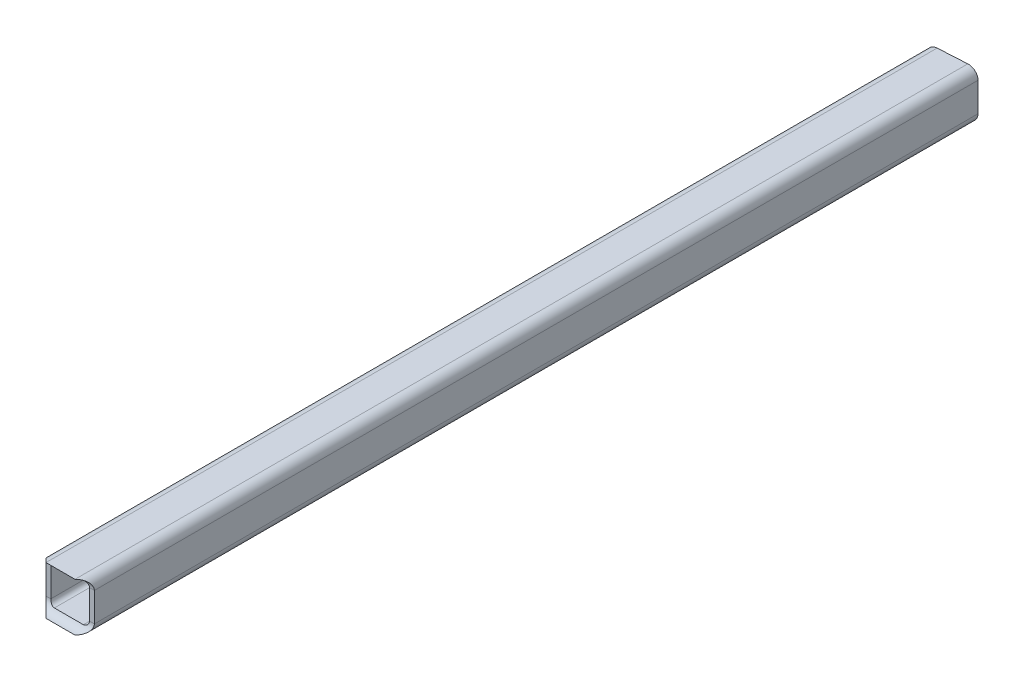
ISO-10303-21;
HEADER;
FILE_DESCRIPTION(('STEP AP214'),'2;1');
FILE_NAME('part.step','',(''),(''),'','','');
FILE_SCHEMA(('AUTOMOTIVE_DESIGN { 1 0 10303 214 1 1 1 1 }'));
ENDSEC;
DATA;
#1=APPLICATION_CONTEXT('core data for automotive mechanical design processes');
#2=APPLICATION_PROTOCOL_DEFINITION('international standard','automotive_design',2000,#1);
#3=PRODUCT_CONTEXT('',#1,'mechanical');
#4=PRODUCT('Part','Part','',(#3));
#5=PRODUCT_RELATED_PRODUCT_CATEGORY('part','',(#4));
#6=PRODUCT_DEFINITION_FORMATION('','',#4);
#7=PRODUCT_DEFINITION_CONTEXT('part definition',#1,'design');
#8=PRODUCT_DEFINITION('design','',#6,#7);
#9=PRODUCT_DEFINITION_SHAPE('','',#8);
#10=(LENGTH_UNIT() NAMED_UNIT(*) SI_UNIT(.MILLI.,.METRE.));
#11=(NAMED_UNIT(*) PLANE_ANGLE_UNIT() SI_UNIT($,.RADIAN.));
#12=(NAMED_UNIT(*) SI_UNIT($,.STERADIAN.) SOLID_ANGLE_UNIT());
#13=UNCERTAINTY_MEASURE_WITH_UNIT(LENGTH_MEASURE(1.E-05),#10,'distance_accuracy_value','');
#14=(GEOMETRIC_REPRESENTATION_CONTEXT(3) GLOBAL_UNCERTAINTY_ASSIGNED_CONTEXT((#13)) GLOBAL_UNIT_ASSIGNED_CONTEXT((#10,
#11,#12)) REPRESENTATION_CONTEXT('',''));
#15=CARTESIAN_POINT('',(0.,0.,0.));
#16=DIRECTION('',(0.,0.,1.));
#17=DIRECTION('',(1.,0.,0.));
#18=AXIS2_PLACEMENT_3D('',#15,#16,#17);
#19=CARTESIAN_POINT('',(-142.,-6.,-825.));
#20=DIRECTION('',(-1.,0.,0.));
#21=DIRECTION('',(0.,0.,1.));
#22=AXIS2_PLACEMENT_3D('',#19,#20,#21);
#23=PLANE('',#22);
#24=DIRECTION('',(0.,0.,1.));
#25=VECTOR('',#24,1.);
#26=CARTESIAN_POINT('',(-142.,-6.,-825.));
#27=LINE('',#26,#25);
#28=CARTESIAN_POINT('',(-142.,-6.00000000000001,-825.455659815234));
#29=VERTEX_POINT('',#28);
#30=CARTESIAN_POINT('',(-142.,-6.00000000000001,-460.));
#31=VERTEX_POINT('',#30);
#32=EDGE_CURVE('E206',#29,#31,#27,.T.);
#33=ORIENTED_EDGE('',*,*,#32,.T.);
#34=DIRECTION('',(0.,1.,0.));
#35=VECTOR('',#34,1.);
#36=CARTESIAN_POINT('',(-142.,-6.00000000000001,-460.));
#37=LINE('',#36,#35);
#38=CARTESIAN_POINT('',(-142.,6.00000000000001,-460.));
#39=VERTEX_POINT('',#38);
#40=EDGE_CURVE('E392',#31,#39,#37,.T.);
#41=ORIENTED_EDGE('',*,*,#40,.T.);
#42=DIRECTION('',(0.,0.,1.));
#43=VECTOR('',#42,1.);
#44=CARTESIAN_POINT('',(-142.,6.00000000000001,-825.));
#45=LINE('',#44,#43);
#46=CARTESIAN_POINT('',(-142.,6.00000000000001,-825.455659815234));
#47=VERTEX_POINT('',#46);
#48=EDGE_CURVE('E45',#47,#39,#45,.T.);
#49=ORIENTED_EDGE('',*,*,#48,.F.);
#50=DIRECTION('',(0.,-1.,0.));
#51=VECTOR('',#50,1.);
#52=CARTESIAN_POINT('',(-142.,-6.00000000000001,-825.455659815234));
#53=LINE('',#52,#51);
#54=EDGE_CURVE('E231',#47,#29,#53,.T.);
#55=ORIENTED_EDGE('',*,*,#54,.T.);
#56=EDGE_LOOP('',(#33,#41,#49,#55));
#57=FACE_BOUND('',#56,.T.);
#58=ADVANCED_FACE('F41',(#57),#23,.T.);
#59=CARTESIAN_POINT('',(-144.,-6.,-825.));
#60=DIRECTION('',(0.,0.,1.));
#61=DIRECTION('',(1.,0.,0.));
#62=AXIS2_PLACEMENT_3D('',#59,#60,#61);
#63=CYLINDRICAL_SURFACE('',#62,2.);
#64=DIRECTION('',(0.,0.,1.));
#65=VECTOR('',#64,1.);
#66=CARTESIAN_POINT('',(-144.,-8.00000000000001,-825.));
#67=LINE('',#66,#65);
#68=CARTESIAN_POINT('',(-144.,-8.00000000000001,-825.341744861426));
#69=VERTEX_POINT('',#68);
#70=CARTESIAN_POINT('',(-144.,-8.00000000000001,-459.464101615138));
#71=VERTEX_POINT('',#70);
#72=EDGE_CURVE('E229',#69,#71,#67,.T.);
#73=ORIENTED_EDGE('',*,*,#72,.T.);
#74=CARTESIAN_POINT('',(-144.,-8.00000000000001,-459.464101615138));
#75=CARTESIAN_POINT('',(-143.947619851414,-8.00000944075038,-459.464086206897));
#76=CARTESIAN_POINT('',(-143.895248262496,-7.9979425660099,-459.465289269472));
#77=CARTESIAN_POINT('',(-143.790962539768,-7.9897304838665,-459.470016320399));
#78=CARTESIAN_POINT('',(-143.739048144673,-7.98358778291064,-459.473538882355));
#79=CARTESIAN_POINT('',(-143.636351237952,-7.96734554188733,-459.482762284618));
#80=CARTESIAN_POINT('',(-143.585563899903,-7.95726921828321,-459.488450339271));
#81=CARTESIAN_POINT('',(-143.485173718524,-7.93329262121618,-459.501794905215));
#82=CARTESIAN_POINT('',(-143.435571011874,-7.91939190879698,-459.509451642461));
#83=CARTESIAN_POINT('',(-143.289230827527,-7.87223817473684,-459.53496935659));
#84=CARTESIAN_POINT('',(-143.194652845894,-7.83348371578986,-459.555408001321));
#85=CARTESIAN_POINT('',(-143.013270104245,-7.74261191461913,-459.600815863802));
#86=CARTESIAN_POINT('',(-142.926478012025,-7.69047330980902,-459.625792271799));
#87=CARTESIAN_POINT('',(-142.755384747508,-7.56932824362969,-459.679939718729));
#88=CARTESIAN_POINT('',(-142.671867171051,-7.49929131747405,-459.709286749353));
#89=CARTESIAN_POINT('',(-142.517168439054,-7.34649138732364,-459.767445210293));
#90=CARTESIAN_POINT('',(-142.44599109068,-7.26372447072445,-459.796256472877));
#91=CARTESIAN_POINT('',(-142.31323462454,-7.08093667986573,-459.852442893317));
#92=CARTESIAN_POINT('',(-142.252637325668,-6.98012524599294,-459.879587168564));
#93=CARTESIAN_POINT('',(-142.149677978647,-6.76820679758344,-459.927034072303));
#94=CARTESIAN_POINT('',(-142.107287730373,-6.65711603105188,-459.947347270489));
#95=CARTESIAN_POINT('',(-142.050318837514,-6.45499780361231,-459.975022138753));
#96=CARTESIAN_POINT('',(-142.031540376796,-6.36541132045005,-459.984307817739));
#97=CARTESIAN_POINT('',(-142.012665253275,-6.22936729210375,-459.99367902764));
#98=CARTESIAN_POINT('',(-142.007922202956,-6.18367126121309,-459.996043321681));
#99=CARTESIAN_POINT('',(-142.001587658245,-6.09198877169574,-459.999205989711));
#100=CARTESIAN_POINT('',(-141.999997460862,-6.04600220134865,-460.000003719249));
#101=CARTESIAN_POINT('',(-142.,-6.00000000000001,-460.));
#102=B_SPLINE_CURVE_WITH_KNOTS('',3,(#74,#75,#76,#77,#78,#79,#80,#81,#82,#83,#84,#85,#86,#87,
#88,#89,#90,#91,#92,#93,#94,#95,#96,#97,#98,#99,#100,#101),.UNSPECIFIED.,.F.,.F.,(4,2,2,2,2,2,2,
2,2,2,2,2,2,4),(0.,0.157071840937227,0.31404717927329,0.470109716412911,0.626190173600552,
0.937421271464443,1.24914989675584,1.58636095727879,1.9236758686098,2.28392845907451,
2.64362103970024,2.9185529216884,3.05643812246952,3.19438003420906),.UNSPECIFIED.);
#103=EDGE_CURVE('E282',#71,#31,#102,.T.);
#104=ORIENTED_EDGE('',*,*,#103,.T.);
#105=ORIENTED_EDGE('',*,*,#32,.F.);
#106=CARTESIAN_POINT('',(-144.,-6.00000000000001,-825.341744861426));
#107=DIRECTION('',(-0.0568653116741472,0.,-0.998381858973911));
#108=DIRECTION('',(-0.998381858973911,0.,0.0568653116741472));
#109=AXIS2_PLACEMENT_3D('',#106,#107,#108);
#110=ELLIPSE('',#109,2.00324152730049,2.);
#111=EDGE_CURVE('E228',#29,#69,#110,.T.);
#112=ORIENTED_EDGE('',*,*,#111,.T.);
#113=EDGE_LOOP('',(#73,#104,#105,#112));
#114=FACE_BOUND('',#113,.T.);
#115=ADVANCED_FACE('F269',(#114),#63,.F.);
#116=CARTESIAN_POINT('',(-144.,-8.00000000000001,-825.));
#117=DIRECTION('',(0.,1.,0.));
#118=DIRECTION('',(0.,0.,1.));
#119=AXIS2_PLACEMENT_3D('',#116,#117,#118);
#120=PLANE('',#119);
#121=DIRECTION('',(0.,0.,1.));
#122=VECTOR('',#121,1.);
#123=CARTESIAN_POINT('',(-156.,-8.00000000000001,-825.));
#124=LINE('',#123,#122);
#125=CARTESIAN_POINT('',(-156.,-8.00000000000001,-824.658255138574));
#126=VERTEX_POINT('',#125);
#127=CARTESIAN_POINT('',(-156.,-8.00000000000001,-459.464101615138));
#128=VERTEX_POINT('',#127);
#129=EDGE_CURVE('E225',#126,#128,#124,.T.);
#130=ORIENTED_EDGE('',*,*,#129,.T.);
#131=DIRECTION('',(1.,0.,0.));
#132=VECTOR('',#131,1.);
#133=CARTESIAN_POINT('',(-150.,-8.00000000000001,-459.464101615138));
#134=LINE('',#133,#132);
#135=EDGE_CURVE('E278',#128,#71,#134,.T.);
#136=ORIENTED_EDGE('',*,*,#135,.T.);
#137=ORIENTED_EDGE('',*,*,#72,.F.);
#138=DIRECTION('',(-0.998381858973911,0.,0.0568653116741472));
#139=VECTOR('',#138,1.);
#140=CARTESIAN_POINT('',(-144.019401982031,-8.00000000000001,-825.340639773482));
#141=LINE('',#140,#139);
#142=EDGE_CURVE('E224',#69,#126,#141,.T.);
#143=ORIENTED_EDGE('',*,*,#142,.T.);
#144=EDGE_LOOP('',(#130,#136,#137,#143));
#145=FACE_BOUND('',#144,.T.);
#146=ADVANCED_FACE('F277',(#145),#120,.T.);
#147=CARTESIAN_POINT('',(-156.,-6.,-825.));
#148=DIRECTION('',(0.,0.,1.));
#149=DIRECTION('',(1.,0.,0.));
#150=AXIS2_PLACEMENT_3D('',#147,#148,#149);
#151=CYLINDRICAL_SURFACE('',#150,2.);
#152=DIRECTION('',(0.,0.,1.));
#153=VECTOR('',#152,1.);
#154=CARTESIAN_POINT('',(-158.,-6.,-825.));
#155=LINE('',#154,#153);
#156=CARTESIAN_POINT('',(-158.,-6.00000000000001,-824.544340184766));
#157=VERTEX_POINT('',#156);
#158=CARTESIAN_POINT('',(-158.,-6.00000000000001,-460.));
#159=VERTEX_POINT('',#158);
#160=EDGE_CURVE('E221',#157,#159,#155,.T.);
#161=ORIENTED_EDGE('',*,*,#160,.T.);
#162=CARTESIAN_POINT('',(-158.,-6.00000000000001,-460.));
#163=CARTESIAN_POINT('',(-158.000008485066,-6.05279734035814,-460.000009372383));
#164=CARTESIAN_POINT('',(-157.99790957026,-6.10558867378728,-459.998954914121));
#165=CARTESIAN_POINT('',(-157.989562836513,-6.21073997309174,-459.994788652164));
#166=CARTESIAN_POINT('',(-157.983316684209,-6.2631001036993,-459.991677674919));
#167=CARTESIAN_POINT('',(-157.966779189475,-6.36677499785739,-459.983487364333));
#168=CARTESIAN_POINT('',(-157.956506484102,-6.41809344797337,-459.97841710113));
#169=CARTESIAN_POINT('',(-157.932042231314,-6.51955728033962,-459.966443571807));
#170=CARTESIAN_POINT('',(-157.917850441376,-6.56970258978428,-459.95954019225));
#171=CARTESIAN_POINT('',(-157.869643691163,-6.7177548740978,-459.936338494309));
#172=CARTESIAN_POINT('',(-157.829962412036,-6.81349322041694,-459.917530603319));
#173=CARTESIAN_POINT('',(-157.736913430591,-6.99686497280345,-459.87494033274));
#174=CARTESIAN_POINT('',(-157.683531907653,-7.08449007215681,-459.851152934385));
#175=CARTESIAN_POINT('',(-157.560968142831,-7.25500902820581,-459.799126144));
#176=CARTESIAN_POINT('',(-157.491031030009,-7.3373051787491,-459.77070543697));
#177=CARTESIAN_POINT('',(-157.338960437571,-7.48955674123603,-459.713200742879));
#178=CARTESIAN_POINT('',(-157.256817165297,-7.55950214501015,-459.684116239278));
#179=CARTESIAN_POINT('',(-157.074966607638,-7.69055248905505,-459.625957223115));
#180=CARTESIAN_POINT('',(-156.974387664184,-7.75053636310677,-459.597061813744));
#181=CARTESIAN_POINT('',(-156.763099313547,-7.85239843675653,-459.545687006942));
#182=CARTESIAN_POINT('',(-156.652412231091,-7.89431542026374,-459.523193901422));
#183=CARTESIAN_POINT('',(-156.451452480325,-7.95046034779688,-459.492344298206));
#184=CARTESIAN_POINT('',(-156.36268650425,-7.9689262582919,-459.481887525367));
#185=CARTESIAN_POINT('',(-156.227766131869,-7.98751089092497,-459.471289002469));
#186=CARTESIAN_POINT('',(-156.182400736289,-7.99218689765274,-459.468603682305));
#187=CARTESIAN_POINT('',(-156.091362583997,-7.99843381186119,-459.465006225644));
#188=CARTESIAN_POINT('',(-156.045689674496,-8.00000304070108,-459.46409504775));
#189=CARTESIAN_POINT('',(-156.,-8.00000000000001,-459.464101615138));
#190=B_SPLINE_CURVE_WITH_KNOTS('',3,(#162,#163,#164,#165,#166,#167,#168,#169,#170,#171,#172,
#173,#174,#175,#176,#177,#178,#179,#180,#181,#182,#183,#184,#185,#186,#187,#188,#189),
.UNSPECIFIED.,.F.,.F.,(4,2,2,2,2,2,2,2,2,2,2,2,2,4),(0.,0.15832980686348,0.316596024669342,
0.474138190899995,0.631690108466988,0.946146500350648,1.26092136705957,1.59454928426014,
1.92844632145531,2.28848800862788,2.64775290324077,2.92045951053446,3.05738651447663,
3.19438748205591),.UNSPECIFIED.);
#191=EDGE_CURVE('E281',#159,#128,#190,.T.);
#192=ORIENTED_EDGE('',*,*,#191,.T.);
#193=ORIENTED_EDGE('',*,*,#129,.F.);
#194=CARTESIAN_POINT('',(-156.,-6.00000000000001,-824.658255138574));
#195=DIRECTION('',(-0.0568653116741472,0.,-0.998381858973911));
#196=DIRECTION('',(-0.998381858973911,0.,0.0568653116741472));
#197=AXIS2_PLACEMENT_3D('',#194,#195,#196);
#198=ELLIPSE('',#197,2.00324152730049,2.);
#199=EDGE_CURVE('E220',#126,#157,#198,.T.);
#200=ORIENTED_EDGE('',*,*,#199,.T.);
#201=EDGE_LOOP('',(#161,#192,#193,#200));
#202=FACE_BOUND('',#201,.T.);
#203=ADVANCED_FACE('F298',(#202),#151,.F.);
#204=CARTESIAN_POINT('',(-158.,6.00000000000001,-825.));
#205=DIRECTION('',(1.,0.,0.));
#206=DIRECTION('',(0.,0.,-1.));
#207=AXIS2_PLACEMENT_3D('',#204,#205,#206);
#208=PLANE('',#207);
#209=DIRECTION('',(0.,0.,1.));
#210=VECTOR('',#209,1.);
#211=CARTESIAN_POINT('',(-158.,6.00000000000001,-825.));
#212=LINE('',#211,#210);
#213=CARTESIAN_POINT('',(-158.,6.00000000000001,-824.544340184766));
#214=VERTEX_POINT('',#213);
#215=CARTESIAN_POINT('',(-158.,6.00000000000001,-460.));
#216=VERTEX_POINT('',#215);
#217=EDGE_CURVE('E217',#214,#216,#212,.T.);
#218=ORIENTED_EDGE('',*,*,#217,.T.);
#219=DIRECTION('',(0.,-1.,0.));
#220=VECTOR('',#219,1.);
#221=CARTESIAN_POINT('',(-158.,6.00000000000001,-460.));
#222=LINE('',#221,#220);
#223=EDGE_CURVE('E389',#216,#159,#222,.T.);
#224=ORIENTED_EDGE('',*,*,#223,.T.);
#225=ORIENTED_EDGE('',*,*,#160,.F.);
#226=DIRECTION('',(0.,1.,0.));
#227=VECTOR('',#226,1.);
#228=CARTESIAN_POINT('',(-158.,6.00000000000001,-824.544340184766));
#229=LINE('',#228,#227);
#230=EDGE_CURVE('E216',#157,#214,#229,.T.);
#231=ORIENTED_EDGE('',*,*,#230,.T.);
#232=EDGE_LOOP('',(#218,#224,#225,#231));
#233=FACE_BOUND('',#232,.T.);
#234=ADVANCED_FACE('F380',(#233),#208,.T.);
#235=CARTESIAN_POINT('',(-156.,6.00000000000001,-825.));
#236=DIRECTION('',(0.,0.,1.));
#237=DIRECTION('',(1.,0.,0.));
#238=AXIS2_PLACEMENT_3D('',#235,#236,#237);
#239=CYLINDRICAL_SURFACE('',#238,2.);
#240=DIRECTION('',(0.,0.,1.));
#241=VECTOR('',#240,1.);
#242=CARTESIAN_POINT('',(-156.,8.00000000000001,-825.));
#243=LINE('',#242,#241);
#244=CARTESIAN_POINT('',(-156.,8.00000000000001,-824.658255138574));
#245=VERTEX_POINT('',#244);
#246=CARTESIAN_POINT('',(-156.,8.00000000000001,-459.464101615138));
#247=VERTEX_POINT('',#246);
#248=EDGE_CURVE('E213',#245,#247,#243,.T.);
#249=ORIENTED_EDGE('',*,*,#248,.T.);
#250=CARTESIAN_POINT('',(-156.,8.00000000000001,-459.464101615138));
#251=CARTESIAN_POINT('',(-156.052380148586,8.00000944075038,-459.464086206897));
#252=CARTESIAN_POINT('',(-156.104751737504,7.9979425660099,-459.465289269472));
#253=CARTESIAN_POINT('',(-156.209037460232,7.9897304838665,-459.470016320399));
#254=CARTESIAN_POINT('',(-156.260951855327,7.98358778291064,-459.473538882355));
#255=CARTESIAN_POINT('',(-156.363648762049,7.96734554188733,-459.482762284618));
#256=CARTESIAN_POINT('',(-156.414436100097,7.95726921828321,-459.488450339271));
#257=CARTESIAN_POINT('',(-156.514826281477,7.93329262121618,-459.501794905215));
#258=CARTESIAN_POINT('',(-156.564428988127,7.91939190879698,-459.509451642461));
#259=CARTESIAN_POINT('',(-156.710769172474,7.87223817473684,-459.53496935659));
#260=CARTESIAN_POINT('',(-156.805347154107,7.83348371578986,-459.555408001321));
#261=CARTESIAN_POINT('',(-156.986729895756,7.74261191461913,-459.600815863802));
#262=CARTESIAN_POINT('',(-157.073521987975,7.69047330980903,-459.625792271799));
#263=CARTESIAN_POINT('',(-157.244615252492,7.56932824362969,-459.679939718729));
#264=CARTESIAN_POINT('',(-157.328132828949,7.49929131747405,-459.709286749353));
#265=CARTESIAN_POINT('',(-157.482831560946,7.34649138732364,-459.767445210293));
#266=CARTESIAN_POINT('',(-157.55400890932,7.26372447072447,-459.796256472877));
#267=CARTESIAN_POINT('',(-157.686765375461,7.08093667986575,-459.852442893317));
#268=CARTESIAN_POINT('',(-157.747362674333,6.98012524599295,-459.879587168564));
#269=CARTESIAN_POINT('',(-157.850322021353,6.76820679758345,-459.927034072303));
#270=CARTESIAN_POINT('',(-157.892712269627,6.65711603105189,-459.947347270489));
#271=CARTESIAN_POINT('',(-157.949681162486,6.45499780361232,-459.975022138753));
#272=CARTESIAN_POINT('',(-157.968459623205,6.36541132045005,-459.984307817739));
#273=CARTESIAN_POINT('',(-157.987334746726,6.22936729210375,-459.99367902764));
#274=CARTESIAN_POINT('',(-157.992077797044,6.1836712612131,-459.996043321681));
#275=CARTESIAN_POINT('',(-157.998412341755,6.09198877169574,-459.999205989711));
#276=CARTESIAN_POINT('',(-158.000002539139,6.04600220134865,-460.00000371925));
#277=CARTESIAN_POINT('',(-158.,6.00000000000001,-460.));
#278=B_SPLINE_CURVE_WITH_KNOTS('',3,(#250,#251,#252,#253,#254,#255,#256,#257,#258,#259,#260,
#261,#262,#263,#264,#265,#266,#267,#268,#269,#270,#271,#272,#273,#274,#275,#276,#277),
.UNSPECIFIED.,.F.,.F.,(4,2,2,2,2,2,2,2,2,2,2,2,2,4),(0.,0.157071840937227,0.31404717927329,
0.470109716412911,0.626190173600552,0.937421271464443,1.24914989675584,1.58636095727879,
1.92367586860979,2.2839284590745,2.64362103970024,2.9185529216884,3.05643812246952,
3.19438003420907),.UNSPECIFIED.);
#279=EDGE_CURVE('E176',#247,#216,#278,.T.);
#280=ORIENTED_EDGE('',*,*,#279,.T.);
#281=ORIENTED_EDGE('',*,*,#217,.F.);
#282=CARTESIAN_POINT('',(-156.,6.00000000000001,-824.658255138574));
#283=DIRECTION('',(-0.0568653116741472,0.,-0.998381858973911));
#284=DIRECTION('',(-0.998381858973911,0.,0.0568653116741472));
#285=AXIS2_PLACEMENT_3D('',#282,#283,#284);
#286=ELLIPSE('',#285,2.00324152730049,2.);
#287=EDGE_CURVE('E211',#214,#245,#286,.T.);
#288=ORIENTED_EDGE('',*,*,#287,.T.);
#289=EDGE_LOOP('',(#249,#280,#281,#288));
#290=FACE_BOUND('',#289,.T.);
#291=ADVANCED_FACE('F385',(#290),#239,.F.);
#292=CARTESIAN_POINT('',(-156.,8.00000000000001,-825.));
#293=DIRECTION('',(0.,-1.,0.));
#294=DIRECTION('',(0.,0.,-1.));
#295=AXIS2_PLACEMENT_3D('',#292,#293,#294);
#296=PLANE('',#295);
#297=DIRECTION('',(0.,0.,1.));
#298=VECTOR('',#297,1.);
#299=CARTESIAN_POINT('',(-144.,8.00000000000001,-825.));
#300=LINE('',#299,#298);
#301=CARTESIAN_POINT('',(-144.,8.00000000000001,-825.341744861426));
#302=VERTEX_POINT('',#301);
#303=CARTESIAN_POINT('',(-144.,8.00000000000001,-459.464101615138));
#304=VERTEX_POINT('',#303);
#305=EDGE_CURVE('E208',#302,#304,#300,.T.);
#306=ORIENTED_EDGE('',*,*,#305,.T.);
#307=DIRECTION('',(1.,0.,0.));
#308=VECTOR('',#307,1.);
#309=CARTESIAN_POINT('',(-150.,8.00000000000001,-459.464101615138));
#310=LINE('',#309,#308);
#311=EDGE_CURVE('E332',#304,#247,#310,.F.);
#312=ORIENTED_EDGE('',*,*,#311,.T.);
#313=ORIENTED_EDGE('',*,*,#248,.F.);
#314=DIRECTION('',(0.998381858973911,0.,-0.0568653116741472));
#315=VECTOR('',#314,1.);
#316=CARTESIAN_POINT('',(-155.980598017969,8.00000000000001,-824.659360226518));
#317=LINE('',#316,#315);
#318=EDGE_CURVE('E212',#245,#302,#317,.T.);
#319=ORIENTED_EDGE('',*,*,#318,.T.);
#320=EDGE_LOOP('',(#306,#312,#313,#319));
#321=FACE_BOUND('',#320,.T.);
#322=ADVANCED_FACE('F339',(#321),#296,.T.);
#323=CARTESIAN_POINT('',(-144.,6.00000000000001,-825.));
#324=DIRECTION('',(0.,0.,1.));
#325=DIRECTION('',(1.,0.,0.));
#326=AXIS2_PLACEMENT_3D('',#323,#324,#325);
#327=CYLINDRICAL_SURFACE('',#326,2.);
#328=ORIENTED_EDGE('',*,*,#48,.T.);
#329=CARTESIAN_POINT('',(-142.,6.00000000000001,-460.));
#330=CARTESIAN_POINT('',(-141.999991514934,6.05279734035814,-460.000009372383));
#331=CARTESIAN_POINT('',(-142.00209042974,6.10558867378728,-459.998954914121));
#332=CARTESIAN_POINT('',(-142.010437163488,6.21073997309174,-459.994788652164));
#333=CARTESIAN_POINT('',(-142.016683315792,6.2631001036993,-459.991677674919));
#334=CARTESIAN_POINT('',(-142.033220810525,6.36677499785739,-459.983487364333));
#335=CARTESIAN_POINT('',(-142.043493515899,6.41809344797337,-459.97841710113));
#336=CARTESIAN_POINT('',(-142.067957768686,6.51955728033962,-459.966443571807));
#337=CARTESIAN_POINT('',(-142.082149558625,6.56970258978428,-459.95954019225));
#338=CARTESIAN_POINT('',(-142.130356308837,6.71775487409781,-459.936338494309));
#339=CARTESIAN_POINT('',(-142.170037587964,6.81349322041694,-459.917530603319));
#340=CARTESIAN_POINT('',(-142.26308656941,6.99686497280346,-459.87494033274));
#341=CARTESIAN_POINT('',(-142.316468092348,7.08449007215682,-459.851152934385));
#342=CARTESIAN_POINT('',(-142.439031857169,7.25500902820582,-459.799126144));
#343=CARTESIAN_POINT('',(-142.508968969992,7.33730517874911,-459.77070543697));
#344=CARTESIAN_POINT('',(-142.66103956243,7.48955674123604,-459.713200742879));
#345=CARTESIAN_POINT('',(-142.743182834703,7.55950214501014,-459.684116239278));
#346=CARTESIAN_POINT('',(-142.925033392363,7.69055248905504,-459.625957223115));
#347=CARTESIAN_POINT('',(-143.025612335816,7.75053636310677,-459.597061813744));
#348=CARTESIAN_POINT('',(-143.236900686454,7.85239843675653,-459.545687006942));
#349=CARTESIAN_POINT('',(-143.34758776891,7.89431542026375,-459.523193901422));
#350=CARTESIAN_POINT('',(-143.548547519675,7.95046034779688,-459.492344298206));
#351=CARTESIAN_POINT('',(-143.63731349575,7.96892625829191,-459.481887525367));
#352=CARTESIAN_POINT('',(-143.772233868132,7.98751089092497,-459.471289002469));
#353=CARTESIAN_POINT('',(-143.817599263712,7.99218689765275,-459.468603682305));
#354=CARTESIAN_POINT('',(-143.908637416003,7.9984338118612,-459.465006225644));
#355=CARTESIAN_POINT('',(-143.954310325505,8.00000304070108,-459.46409504775));
#356=CARTESIAN_POINT('',(-144.,8.00000000000001,-459.464101615138));
#357=B_SPLINE_CURVE_WITH_KNOTS('',3,(#329,#330,#331,#332,#333,#334,#335,#336,#337,#338,#339,
#340,#341,#342,#343,#344,#345,#346,#347,#348,#349,#350,#351,#352,#353,#354,#355,#356),
.UNSPECIFIED.,.F.,.F.,(4,2,2,2,2,2,2,2,2,2,2,2,2,4),(0.,0.158329806863482,0.316596024669342,
0.474138190899996,0.631690108466989,0.946146500350653,1.26092136705957,1.59454928426014,
1.92844632145531,2.28848800862784,2.64775290324077,2.92045951053452,3.05738651447669,
3.19438748205591),.UNSPECIFIED.);
#358=EDGE_CURVE('E324',#39,#304,#357,.T.);
#359=ORIENTED_EDGE('',*,*,#358,.T.);
#360=ORIENTED_EDGE('',*,*,#305,.F.);
#361=CARTESIAN_POINT('',(-144.,6.00000000000001,-825.341744861426));
#362=DIRECTION('',(-0.0568653116741472,0.,-0.998381858973911));
#363=DIRECTION('',(-0.998381858973911,0.,0.0568653116741472));
#364=AXIS2_PLACEMENT_3D('',#361,#362,#363);
#365=ELLIPSE('',#364,2.00324152730049,2.);
#366=EDGE_CURVE('E203',#302,#47,#365,.T.);
#367=ORIENTED_EDGE('',*,*,#366,.T.);
#368=EDGE_LOOP('',(#328,#359,#360,#367));
#369=FACE_BOUND('',#368,.T.);
#370=ADVANCED_FACE('F334',(#369),#327,.F.);
#371=CARTESIAN_POINT('',(-150.,0.,-825.));
#372=DIRECTION('',(-0.0568653116741472,0.,-0.998381858973911));
#373=DIRECTION('',(-0.998381858973911,0.,0.0568653116741472));
#374=AXIS2_PLACEMENT_3D('',#371,#372,#373);
#375=PLANE('',#374);
#376=ORIENTED_EDGE('',*,*,#366,.F.);
#377=ORIENTED_EDGE('',*,*,#318,.F.);
#378=ORIENTED_EDGE('',*,*,#287,.F.);
#379=ORIENTED_EDGE('',*,*,#230,.F.);
#380=ORIENTED_EDGE('',*,*,#199,.F.);
#381=ORIENTED_EDGE('',*,*,#142,.F.);
#382=ORIENTED_EDGE('',*,*,#111,.F.);
#383=ORIENTED_EDGE('',*,*,#54,.F.);
#384=EDGE_LOOP('',(#376,#377,#378,#379,#380,#381,#382,#383));
#385=FACE_BOUND('',#384,.T.);
#386=DIRECTION('',(0.,1.,0.));
#387=VECTOR('',#386,1.);
#388=CARTESIAN_POINT('',(-160.,6.,-824.430425230957));
#389=LINE('',#388,#387);
#390=CARTESIAN_POINT('',(-160.,-6.,-824.430425230957));
#391=VERTEX_POINT('',#390);
#392=CARTESIAN_POINT('',(-160.,6.,-824.430425230957));
#393=VERTEX_POINT('',#392);
#394=EDGE_CURVE('E189',#391,#393,#389,.T.);
#395=ORIENTED_EDGE('',*,*,#394,.T.);
#396=CARTESIAN_POINT('',(-156.,6.00000000000001,-824.658255138574));
#397=DIRECTION('',(-0.0568653116741472,0.,-0.998381858973911));
#398=DIRECTION('',(-0.998381858973911,0.,0.0568653116741472));
#399=AXIS2_PLACEMENT_3D('',#396,#397,#398);
#400=ELLIPSE('',#399,4.00648305460099,4.);
#401=CARTESIAN_POINT('',(-156.,10.,-824.658255138574));
#402=VERTEX_POINT('',#401);
#403=EDGE_CURVE('E254',#393,#402,#400,.T.);
#404=ORIENTED_EDGE('',*,*,#403,.T.);
#405=DIRECTION('',(0.998381858973911,0.,-0.0568653116741472));
#406=VECTOR('',#405,1.);
#407=CARTESIAN_POINT('',(-155.980598017969,10.,-824.659360226518));
#408=LINE('',#407,#406);
#409=CARTESIAN_POINT('',(-144.,10.,-825.341744861426));
#410=VERTEX_POINT('',#409);
#411=EDGE_CURVE('E181',#402,#410,#408,.T.);
#412=ORIENTED_EDGE('',*,*,#411,.T.);
#413=CARTESIAN_POINT('',(-144.,6.00000000000001,-825.341744861426));
#414=DIRECTION('',(-0.0568653116741472,0.,-0.998381858973911));
#415=DIRECTION('',(-0.998381858973911,0.,0.0568653116741472));
#416=AXIS2_PLACEMENT_3D('',#413,#414,#415);
#417=ELLIPSE('',#416,4.00648305460099,4.);
#418=CARTESIAN_POINT('',(-140.,6.00000000000001,-825.569574769043));
#419=VERTEX_POINT('',#418);
#420=EDGE_CURVE('E250',#410,#419,#417,.T.);
#421=ORIENTED_EDGE('',*,*,#420,.T.);
#422=DIRECTION('',(0.,-1.,0.));
#423=VECTOR('',#422,1.);
#424=CARTESIAN_POINT('',(-140.,-6.,-825.569574769043));
#425=LINE('',#424,#423);
#426=CARTESIAN_POINT('',(-140.,-6.,-825.569574769043));
#427=VERTEX_POINT('',#426);
#428=EDGE_CURVE('E247',#419,#427,#425,.T.);
#429=ORIENTED_EDGE('',*,*,#428,.T.);
#430=CARTESIAN_POINT('',(-144.,-6.00000000000001,-825.341744861426));
#431=DIRECTION('',(-0.0568653116741472,0.,-0.998381858973911));
#432=DIRECTION('',(-0.998381858973911,0.,0.0568653116741472));
#433=AXIS2_PLACEMENT_3D('',#430,#431,#432);
#434=ELLIPSE('',#433,4.00648305460099,4.);
#435=CARTESIAN_POINT('',(-144.,-10.,-825.341744861426));
#436=VERTEX_POINT('',#435);
#437=EDGE_CURVE('E244',#427,#436,#434,.T.);
#438=ORIENTED_EDGE('',*,*,#437,.T.);
#439=DIRECTION('',(-0.998381858973911,0.,0.0568653116741472));
#440=VECTOR('',#439,1.);
#441=CARTESIAN_POINT('',(-144.019401982031,-10.,-825.340639773482));
#442=LINE('',#441,#440);
#443=CARTESIAN_POINT('',(-156.,-10.,-824.658255138574));
#444=VERTEX_POINT('',#443);
#445=EDGE_CURVE('E50',#436,#444,#442,.T.);
#446=ORIENTED_EDGE('',*,*,#445,.T.);
#447=CARTESIAN_POINT('',(-156.,-6.00000000000001,-824.658255138574));
#448=DIRECTION('',(-0.0568653116741472,0.,-0.998381858973911));
#449=DIRECTION('',(-0.998381858973911,0.,0.0568653116741472));
#450=AXIS2_PLACEMENT_3D('',#447,#448,#449);
#451=ELLIPSE('',#450,4.00648305460099,4.);
#452=EDGE_CURVE('E11',#444,#391,#451,.T.);
#453=ORIENTED_EDGE('',*,*,#452,.T.);
#454=EDGE_LOOP('',(#395,#404,#412,#421,#429,#438,#446,#453));
#455=FACE_BOUND('',#454,.T.);
#456=ADVANCED_FACE('F43',(#385,#455),#375,.T.);
#457=CARTESIAN_POINT('',(-160.,6.00000000000001,-825.));
#458=DIRECTION('',(1.,0.,0.));
#459=DIRECTION('',(0.,0.,-1.));
#460=AXIS2_PLACEMENT_3D('',#457,#458,#459);
#461=PLANE('',#460);
#462=DIRECTION('',(0.,1.,0.));
#463=VECTOR('',#462,1.);
#464=CARTESIAN_POINT('',(-159.999999999999,-6.,-459.999999999999));
#465=LINE('',#464,#463);
#466=CARTESIAN_POINT('',(-159.999999999999,-6.,-459.999999999999));
#467=VERTEX_POINT('',#466);
#468=CARTESIAN_POINT('',(-160.,6.00000000000001,-460.));
#469=VERTEX_POINT('',#468);
#470=EDGE_CURVE('E177',#467,#469,#465,.T.);
#471=ORIENTED_EDGE('',*,*,#470,.T.);
#472=DIRECTION('',(0.,0.,1.));
#473=VECTOR('',#472,1.);
#474=CARTESIAN_POINT('',(-160.,6.00000000000001,-825.));
#475=LINE('',#474,#473);
#476=EDGE_CURVE('E175',#393,#469,#475,.T.);
#477=ORIENTED_EDGE('',*,*,#476,.F.);
#478=ORIENTED_EDGE('',*,*,#394,.F.);
#479=DIRECTION('',(0.,0.,1.));
#480=VECTOR('',#479,1.);
#481=CARTESIAN_POINT('',(-160.,-6.,-825.));
#482=LINE('',#481,#480);
#483=EDGE_CURVE('E204',#391,#467,#482,.T.);
#484=ORIENTED_EDGE('',*,*,#483,.T.);
#485=EDGE_LOOP('',(#471,#477,#478,#484));
#486=FACE_BOUND('',#485,.T.);
#487=ADVANCED_FACE('F341',(#486),#461,.F.);
#488=CARTESIAN_POINT('',(-156.,-6.,-825.));
#489=DIRECTION('',(0.,0.,1.));
#490=DIRECTION('',(1.,0.,0.));
#491=AXIS2_PLACEMENT_3D('',#488,#489,#490);
#492=CYLINDRICAL_SURFACE('',#491,4.);
#493=CARTESIAN_POINT('',(-155.999999999999,-6.,-455.999999999999));
#494=DIRECTION('',(0.707106781186548,0.,-0.707106781186548));
#495=DIRECTION('',(-0.707106781186548,0.,-0.707106781186547));
#496=AXIS2_PLACEMENT_3D('',#493,#494,#495);
#497=ELLIPSE('',#496,5.65685424949239,4.);
#498=CARTESIAN_POINT('',(-155.999999999999,-10.,-455.999999999999));
#499=VERTEX_POINT('',#498);
#500=EDGE_CURVE('E166',#499,#467,#497,.T.);
#501=ORIENTED_EDGE('',*,*,#500,.T.);
#502=ORIENTED_EDGE('',*,*,#483,.F.);
#503=ORIENTED_EDGE('',*,*,#452,.F.);
#504=DIRECTION('',(0.,0.,1.));
#505=VECTOR('',#504,1.);
#506=CARTESIAN_POINT('',(-156.,-10.,-825.));
#507=LINE('',#506,#505);
#508=EDGE_CURVE('E200',#444,#499,#507,.T.);
#509=ORIENTED_EDGE('',*,*,#508,.T.);
#510=EDGE_LOOP('',(#501,#502,#503,#509));
#511=FACE_BOUND('',#510,.T.);
#512=ADVANCED_FACE('F344',(#511),#492,.T.);
#513=CARTESIAN_POINT('',(-144.,-10.,-825.));
#514=DIRECTION('',(0.,1.,0.));
#515=DIRECTION('',(0.,0.,1.));
#516=AXIS2_PLACEMENT_3D('',#513,#514,#515);
#517=PLANE('',#516);
#518=DIRECTION('',(0.,0.,1.));
#519=VECTOR('',#518,1.);
#520=CARTESIAN_POINT('',(-144.,-10.,-825.));
#521=LINE('',#520,#519);
#522=CARTESIAN_POINT('',(-144.,-10.,-456.));
#523=VERTEX_POINT('',#522);
#524=EDGE_CURVE('E197',#436,#523,#521,.T.);
#525=ORIENTED_EDGE('',*,*,#524,.T.);
#526=DIRECTION('',(1.,0.,0.));
#527=VECTOR('',#526,1.);
#528=CARTESIAN_POINT('',(-150.,-10.,-456.));
#529=LINE('',#528,#527);
#530=EDGE_CURVE('E415',#499,#523,#529,.T.);
#531=ORIENTED_EDGE('',*,*,#530,.F.);
#532=ORIENTED_EDGE('',*,*,#508,.F.);
#533=ORIENTED_EDGE('',*,*,#445,.F.);
#534=EDGE_LOOP('',(#525,#531,#532,#533));
#535=FACE_BOUND('',#534,.T.);
#536=ADVANCED_FACE('F348',(#535),#517,.F.);
#537=CARTESIAN_POINT('',(-144.,-6.,-825.));
#538=DIRECTION('',(0.,0.,1.));
#539=DIRECTION('',(1.,0.,0.));
#540=AXIS2_PLACEMENT_3D('',#537,#538,#539);
#541=CYLINDRICAL_SURFACE('',#540,4.);
#542=CARTESIAN_POINT('',(-144.,-6.,-456.));
#543=DIRECTION('',(0.707106781186548,0.,0.707106781186547));
#544=DIRECTION('',(-0.707106781186548,0.,0.707106781186548));
#545=AXIS2_PLACEMENT_3D('',#542,#543,#544);
#546=ELLIPSE('',#545,5.65685424949239,4.);
#547=CARTESIAN_POINT('',(-140.,-6.,-460.));
#548=VERTEX_POINT('',#547);
#549=EDGE_CURVE('E186',#523,#548,#546,.T.);
#550=ORIENTED_EDGE('',*,*,#549,.F.);
#551=ORIENTED_EDGE('',*,*,#524,.F.);
#552=ORIENTED_EDGE('',*,*,#437,.F.);
#553=DIRECTION('',(0.,0.,1.));
#554=VECTOR('',#553,1.);
#555=CARTESIAN_POINT('',(-140.,-6.,-825.));
#556=LINE('',#555,#554);
#557=EDGE_CURVE('E194',#427,#548,#556,.T.);
#558=ORIENTED_EDGE('',*,*,#557,.T.);
#559=EDGE_LOOP('',(#550,#551,#552,#558));
#560=FACE_BOUND('',#559,.T.);
#561=ADVANCED_FACE('F352',(#560),#541,.T.);
#562=CARTESIAN_POINT('',(-140.,-6.,-825.));
#563=DIRECTION('',(-1.,0.,0.));
#564=DIRECTION('',(0.,0.,1.));
#565=AXIS2_PLACEMENT_3D('',#562,#563,#564);
#566=PLANE('',#565);
#567=DIRECTION('',(0.,1.,0.));
#568=VECTOR('',#567,1.);
#569=CARTESIAN_POINT('',(-140.,-6.,-460.));
#570=LINE('',#569,#568);
#571=CARTESIAN_POINT('',(-140.,6.00000000000001,-460.));
#572=VERTEX_POINT('',#571);
#573=EDGE_CURVE('E284',#548,#572,#570,.T.);
#574=ORIENTED_EDGE('',*,*,#573,.F.);
#575=ORIENTED_EDGE('',*,*,#557,.F.);
#576=ORIENTED_EDGE('',*,*,#428,.F.);
#577=DIRECTION('',(0.,0.,1.));
#578=VECTOR('',#577,1.);
#579=CARTESIAN_POINT('',(-140.,6.00000000000001,-825.));
#580=LINE('',#579,#578);
#581=EDGE_CURVE('E184',#419,#572,#580,.T.);
#582=ORIENTED_EDGE('',*,*,#581,.T.);
#583=EDGE_LOOP('',(#574,#575,#576,#582));
#584=FACE_BOUND('',#583,.T.);
#585=ADVANCED_FACE('F356',(#584),#566,.F.);
#586=CARTESIAN_POINT('',(-144.,6.00000000000001,-825.));
#587=DIRECTION('',(0.,0.,1.));
#588=DIRECTION('',(1.,0.,0.));
#589=AXIS2_PLACEMENT_3D('',#586,#587,#588);
#590=CYLINDRICAL_SURFACE('',#589,4.);
#591=CARTESIAN_POINT('',(-144.,6.00000000000001,-456.));
#592=DIRECTION('',(0.707106781186548,0.,0.707106781186547));
#593=DIRECTION('',(-0.707106781186548,0.,0.707106781186548));
#594=AXIS2_PLACEMENT_3D('',#591,#592,#593);
#595=ELLIPSE('',#594,5.65685424949239,4.);
#596=CARTESIAN_POINT('',(-144.,10.,-456.));
#597=VERTEX_POINT('',#596);
#598=EDGE_CURVE('E161',#572,#597,#595,.T.);
#599=ORIENTED_EDGE('',*,*,#598,.F.);
#600=ORIENTED_EDGE('',*,*,#581,.F.);
#601=ORIENTED_EDGE('',*,*,#420,.F.);
#602=DIRECTION('',(0.,0.,1.));
#603=VECTOR('',#602,1.);
#604=CARTESIAN_POINT('',(-144.,10.,-825.));
#605=LINE('',#604,#603);
#606=EDGE_CURVE('E182',#410,#597,#605,.T.);
#607=ORIENTED_EDGE('',*,*,#606,.T.);
#608=EDGE_LOOP('',(#599,#600,#601,#607));
#609=FACE_BOUND('',#608,.T.);
#610=ADVANCED_FACE('F360',(#609),#590,.T.);
#611=CARTESIAN_POINT('',(-156.,10.,-825.));
#612=DIRECTION('',(0.,-1.,0.));
#613=DIRECTION('',(0.,0.,-1.));
#614=AXIS2_PLACEMENT_3D('',#611,#612,#613);
#615=PLANE('',#614);
#616=DIRECTION('',(1.,0.,0.));
#617=VECTOR('',#616,1.);
#618=CARTESIAN_POINT('',(-150.,10.,-456.));
#619=LINE('',#618,#617);
#620=CARTESIAN_POINT('',(-155.999999999999,10.,-455.999999999999));
#621=VERTEX_POINT('',#620);
#622=EDGE_CURVE('E155',#621,#597,#619,.T.);
#623=ORIENTED_EDGE('',*,*,#622,.T.);
#624=ORIENTED_EDGE('',*,*,#606,.F.);
#625=ORIENTED_EDGE('',*,*,#411,.F.);
#626=DIRECTION('',(0.,0.,1.));
#627=VECTOR('',#626,1.);
#628=CARTESIAN_POINT('',(-156.,10.,-825.));
#629=LINE('',#628,#627);
#630=EDGE_CURVE('E173',#402,#621,#629,.T.);
#631=ORIENTED_EDGE('',*,*,#630,.T.);
#632=EDGE_LOOP('',(#623,#624,#625,#631));
#633=FACE_BOUND('',#632,.T.);
#634=ADVANCED_FACE('F179',(#633),#615,.F.);
#635=CARTESIAN_POINT('',(-156.,6.00000000000001,-825.));
#636=DIRECTION('',(0.,0.,1.));
#637=DIRECTION('',(1.,0.,0.));
#638=AXIS2_PLACEMENT_3D('',#635,#636,#637);
#639=CYLINDRICAL_SURFACE('',#638,4.);
#640=CARTESIAN_POINT('',(-155.999999999999,6.00000000000001,-455.999999999999));
#641=DIRECTION('',(0.707106781186548,0.,-0.707106781186548));
#642=DIRECTION('',(-0.707106781186548,0.,-0.707106781186547));
#643=AXIS2_PLACEMENT_3D('',#640,#641,#642);
#644=ELLIPSE('',#643,5.65685424949239,4.);
#645=EDGE_CURVE('E158',#469,#621,#644,.T.);
#646=ORIENTED_EDGE('',*,*,#645,.T.);
#647=ORIENTED_EDGE('',*,*,#630,.F.);
#648=ORIENTED_EDGE('',*,*,#403,.F.);
#649=ORIENTED_EDGE('',*,*,#476,.T.);
#650=EDGE_LOOP('',(#646,#647,#648,#649));
#651=FACE_BOUND('',#650,.T.);
#652=ADVANCED_FACE('F171',(#651),#639,.T.);
#653=CARTESIAN_POINT('',(-150.,-6.00000000000001,-460.));
#654=DIRECTION('',(0.,0.,1.));
#655=DIRECTION('',(1.,0.,0.));
#656=AXIS2_PLACEMENT_3D('',#653,#654,#655);
#657=PLANE('',#656);
#658=ORIENTED_EDGE('',*,*,#573,.T.);
#659=DIRECTION('',(1.,0.,0.));
#660=VECTOR('',#659,1.);
#661=CARTESIAN_POINT('',(-150.,6.00000000000001,-460.));
#662=LINE('',#661,#660);
#663=EDGE_CURVE('E58',#39,#572,#662,.T.);
#664=ORIENTED_EDGE('',*,*,#663,.F.);
#665=ORIENTED_EDGE('',*,*,#40,.F.);
#666=DIRECTION('',(1.,0.,0.));
#667=VECTOR('',#666,1.);
#668=CARTESIAN_POINT('',(-150.,-6.00000000000001,-460.));
#669=LINE('',#668,#667);
#670=EDGE_CURVE('E417',#31,#548,#669,.T.);
#671=ORIENTED_EDGE('',*,*,#670,.T.);
#672=EDGE_LOOP('',(#658,#664,#665,#671));
#673=FACE_BOUND('',#672,.T.);
#674=ADVANCED_FACE('F307',(#673),#657,.T.);
#675=EDGE_CURVE('E66',#469,#216,#662,.T.);
#676=ORIENTED_EDGE('',*,*,#675,.F.);
#677=ORIENTED_EDGE('',*,*,#470,.F.);
#678=EDGE_CURVE('E404',#467,#159,#669,.T.);
#679=ORIENTED_EDGE('',*,*,#678,.T.);
#680=ORIENTED_EDGE('',*,*,#223,.F.);
#681=EDGE_LOOP('',(#676,#677,#679,#680));
#682=FACE_BOUND('',#681,.T.);
#683=ADVANCED_FACE('F306',(#682),#657,.T.);
#684=CARTESIAN_POINT('',(-150.,-6.,-456.));
#685=DIRECTION('',(1.,0.,0.));
#686=DIRECTION('',(0.,0.,-1.));
#687=AXIS2_PLACEMENT_3D('',#684,#685,#686);
#688=CYLINDRICAL_SURFACE('',#687,4.);
#689=ORIENTED_EDGE('',*,*,#549,.T.);
#690=ORIENTED_EDGE('',*,*,#670,.F.);
#691=ORIENTED_EDGE('',*,*,#103,.F.);
#692=ORIENTED_EDGE('',*,*,#135,.F.);
#693=ORIENTED_EDGE('',*,*,#191,.F.);
#694=ORIENTED_EDGE('',*,*,#678,.F.);
#695=ORIENTED_EDGE('',*,*,#500,.F.);
#696=ORIENTED_EDGE('',*,*,#530,.T.);
#697=EDGE_LOOP('',(#689,#690,#691,#692,#693,#694,#695,#696));
#698=FACE_BOUND('',#697,.T.);
#699=ADVANCED_FACE('F302',(#698),#688,.F.);
#700=CARTESIAN_POINT('',(-150.,6.00000000000001,-456.));
#701=DIRECTION('',(1.,0.,0.));
#702=DIRECTION('',(0.,0.,-1.));
#703=AXIS2_PLACEMENT_3D('',#700,#701,#702);
#704=CYLINDRICAL_SURFACE('',#703,4.);
#705=ORIENTED_EDGE('',*,*,#598,.T.);
#706=ORIENTED_EDGE('',*,*,#622,.F.);
#707=ORIENTED_EDGE('',*,*,#645,.F.);
#708=ORIENTED_EDGE('',*,*,#675,.T.);
#709=ORIENTED_EDGE('',*,*,#279,.F.);
#710=ORIENTED_EDGE('',*,*,#311,.F.);
#711=ORIENTED_EDGE('',*,*,#358,.F.);
#712=ORIENTED_EDGE('',*,*,#663,.T.);
#713=EDGE_LOOP('',(#705,#706,#707,#708,#709,#710,#711,#712));
#714=FACE_BOUND('',#713,.T.);
#715=ADVANCED_FACE('F157',(#714),#704,.F.);
#716=CLOSED_SHELL('',(#58,#115,#146,#203,#234,#291,#322,#370,#456,#487,#512,#536,#561,#585,#610,
#634,#652,#674,#683,#699,#715));
#717=MANIFOLD_SOLID_BREP('B2',#716);
#718=ADVANCED_BREP_SHAPE_REPRESENTATION('',(#18,#717),#14);
#719=SHAPE_DEFINITION_REPRESENTATION(#9,#718);
ENDSEC;
END-ISO-10303-21;
